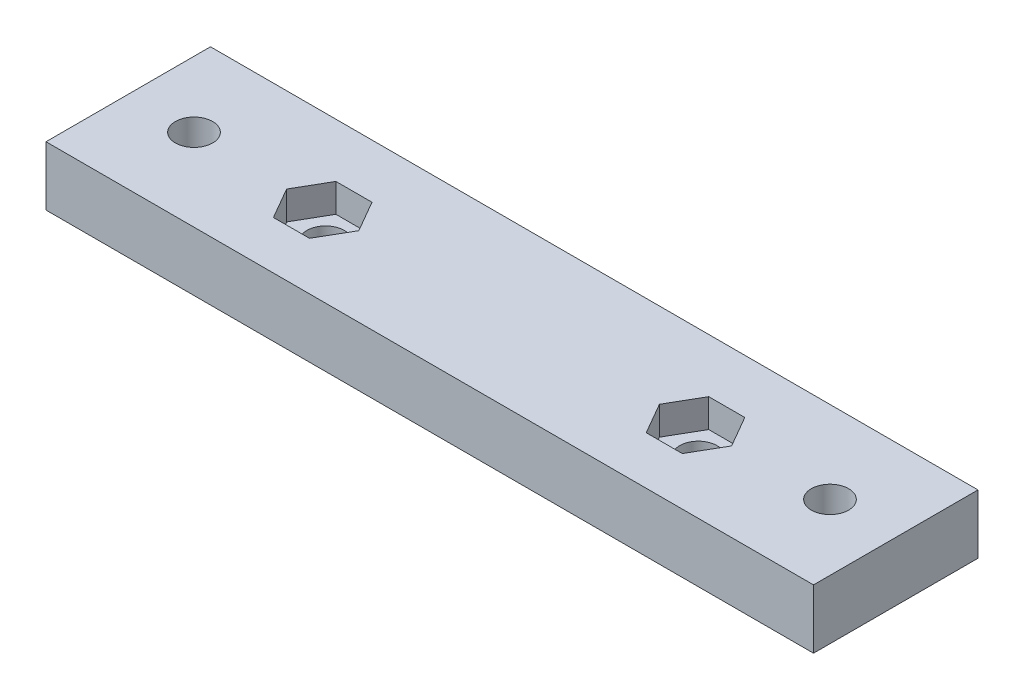
ISO-10303-21;
HEADER;
FILE_DESCRIPTION(('STEP AP214'),'2;1');
FILE_NAME('part.step','',(''),(''),'','','');
FILE_SCHEMA(('AUTOMOTIVE_DESIGN { 1 0 10303 214 1 1 1 1 }'));
ENDSEC;
DATA;
#1=APPLICATION_CONTEXT('core data for automotive mechanical design processes');
#2=APPLICATION_PROTOCOL_DEFINITION('international standard','automotive_design',2000,#1);
#3=PRODUCT_CONTEXT('',#1,'mechanical');
#4=PRODUCT('Part','Part','',(#3));
#5=PRODUCT_RELATED_PRODUCT_CATEGORY('part','',(#4));
#6=PRODUCT_DEFINITION_FORMATION('','',#4);
#7=PRODUCT_DEFINITION_CONTEXT('part definition',#1,'design');
#8=PRODUCT_DEFINITION('design','',#6,#7);
#9=PRODUCT_DEFINITION_SHAPE('','',#8);
#10=(LENGTH_UNIT() NAMED_UNIT(*) SI_UNIT(.MILLI.,.METRE.));
#11=(NAMED_UNIT(*) PLANE_ANGLE_UNIT() SI_UNIT($,.RADIAN.));
#12=(NAMED_UNIT(*) SI_UNIT($,.STERADIAN.) SOLID_ANGLE_UNIT());
#13=UNCERTAINTY_MEASURE_WITH_UNIT(LENGTH_MEASURE(1.E-05),#10,'distance_accuracy_value','');
#14=(GEOMETRIC_REPRESENTATION_CONTEXT(3) GLOBAL_UNCERTAINTY_ASSIGNED_CONTEXT((#13)) GLOBAL_UNIT_ASSIGNED_CONTEXT((#10,
#11,#12)) REPRESENTATION_CONTEXT('',''));
#15=CARTESIAN_POINT('',(0.,0.,0.));
#16=DIRECTION('',(0.,0.,1.));
#17=DIRECTION('',(1.,0.,0.));
#18=AXIS2_PLACEMENT_3D('',#15,#16,#17);
#19=CARTESIAN_POINT('',(0.,5.4,0.));
#20=DIRECTION('',(0.,-1.,0.));
#21=DIRECTION('',(0.,0.,-1.));
#22=AXIS2_PLACEMENT_3D('',#19,#20,#21);
#23=PLANE('',#22);
#24=CARTESIAN_POINT('',(-29.,5.4,0.));
#25=DIRECTION('',(0.,1.,0.));
#26=DIRECTION('',(0.,0.,1.));
#27=AXIS2_PLACEMENT_3D('',#24,#25,#26);
#28=CIRCLE('',#27,1.7);
#29=CARTESIAN_POINT('',(-29.,5.4,1.7));
#30=VERTEX_POINT('',#29);
#31=EDGE_CURVE('E286',#30,#30,#28,.T.);
#32=ORIENTED_EDGE('',*,*,#31,.F.);
#33=EDGE_LOOP('',(#32));
#34=FACE_BOUND('',#33,.T.);
#35=CARTESIAN_POINT('',(29.,5.4,0.));
#36=DIRECTION('',(0.,1.,0.));
#37=DIRECTION('',(0.,0.,-1.));
#38=AXIS2_PLACEMENT_3D('',#35,#36,#37);
#39=CIRCLE('',#38,1.7);
#40=CARTESIAN_POINT('',(29.,5.4,1.69999999999999));
#41=VERTEX_POINT('',#40);
#42=EDGE_CURVE('E297',#41,#41,#39,.T.);
#43=ORIENTED_EDGE('',*,*,#42,.F.);
#44=EDGE_LOOP('',(#43));
#45=FACE_BOUND('',#44,.T.);
#46=DIRECTION('',(-1.,0.,0.));
#47=VECTOR('',#46,1.);
#48=CARTESIAN_POINT('',(-15.3545517328094,5.4,-2.58658374021367));
#49=LINE('',#48,#47);
#50=CARTESIAN_POINT('',(-15.3545517328094,5.4,-2.58658374021367));
#51=VERTEX_POINT('',#50);
#52=CARTESIAN_POINT('',(-18.6454482671903,5.4,-2.58658374021367));
#53=VERTEX_POINT('',#52);
#54=EDGE_CURVE('E193',#51,#53,#49,.T.);
#55=ORIENTED_EDGE('',*,*,#54,.F.);
#56=DIRECTION('',(-0.500000000000001,0.,-0.866025403784438));
#57=VECTOR('',#56,1.);
#58=CARTESIAN_POINT('',(-13.709103465619,5.4,0.263416259786324));
#59=LINE('',#58,#57);
#60=CARTESIAN_POINT('',(-13.709103465619,5.4,0.263416259786324));
#61=VERTEX_POINT('',#60);
#62=EDGE_CURVE('E57',#61,#51,#59,.T.);
#63=ORIENTED_EDGE('',*,*,#62,.F.);
#64=DIRECTION('',(0.5,0.,-0.866025403784439));
#65=VECTOR('',#64,1.);
#66=CARTESIAN_POINT('',(-15.3545517328094,5.4,3.11341625978633));
#67=LINE('',#66,#65);
#68=CARTESIAN_POINT('',(-15.3545517328094,5.4,3.11341625978633));
#69=VERTEX_POINT('',#68);
#70=EDGE_CURVE('E177',#69,#61,#67,.T.);
#71=ORIENTED_EDGE('',*,*,#70,.F.);
#72=DIRECTION('',(1.,0.,0.));
#73=VECTOR('',#72,1.);
#74=CARTESIAN_POINT('',(-18.6454482671903,5.4,3.11341625978633));
#75=LINE('',#74,#73);
#76=CARTESIAN_POINT('',(-18.6454482671903,5.4,3.11341625978633));
#77=VERTEX_POINT('',#76);
#78=EDGE_CURVE('E180',#77,#69,#75,.T.);
#79=ORIENTED_EDGE('',*,*,#78,.F.);
#80=DIRECTION('',(0.5,0.,0.866025403784439));
#81=VECTOR('',#80,1.);
#82=CARTESIAN_POINT('',(-20.2908965343807,5.4,0.263416259786325));
#83=LINE('',#82,#81);
#84=CARTESIAN_POINT('',(-20.2908965343807,5.4,0.263416259786325));
#85=VERTEX_POINT('',#84);
#86=EDGE_CURVE('E200',#85,#77,#83,.T.);
#87=ORIENTED_EDGE('',*,*,#86,.F.);
#88=DIRECTION('',(-0.5,0.,0.866025403784439));
#89=VECTOR('',#88,1.);
#90=CARTESIAN_POINT('',(-18.6454482671903,5.4,-2.58658374021367));
#91=LINE('',#90,#89);
#92=EDGE_CURVE('E198',#53,#85,#91,.T.);
#93=ORIENTED_EDGE('',*,*,#92,.F.);
#94=EDGE_LOOP('',(#55,#63,#71,#79,#87,#93));
#95=FACE_BOUND('',#94,.T.);
#96=DIRECTION('',(0.,0.,-1.));
#97=VECTOR('',#96,1.);
#98=CARTESIAN_POINT('',(35.,5.4,7.5));
#99=LINE('',#98,#97);
#100=CARTESIAN_POINT('',(35.,5.4,7.5));
#101=VERTEX_POINT('',#100);
#102=CARTESIAN_POINT('',(35.,5.4,-7.5));
#103=VERTEX_POINT('',#102);
#104=EDGE_CURVE('E254',#101,#103,#99,.T.);
#105=ORIENTED_EDGE('',*,*,#104,.T.);
#106=DIRECTION('',(-1.,0.,0.));
#107=VECTOR('',#106,1.);
#108=CARTESIAN_POINT('',(-35.,5.4,-7.5));
#109=LINE('',#108,#107);
#110=CARTESIAN_POINT('',(-35.,5.4,-7.5));
#111=VERTEX_POINT('',#110);
#112=EDGE_CURVE('E256',#103,#111,#109,.T.);
#113=ORIENTED_EDGE('',*,*,#112,.T.);
#114=DIRECTION('',(0.,0.,1.));
#115=VECTOR('',#114,1.);
#116=CARTESIAN_POINT('',(-35.,5.4,7.5));
#117=LINE('',#116,#115);
#118=CARTESIAN_POINT('',(-35.,5.4,7.5));
#119=VERTEX_POINT('',#118);
#120=EDGE_CURVE('E261',#111,#119,#117,.T.);
#121=ORIENTED_EDGE('',*,*,#120,.T.);
#122=DIRECTION('',(1.,0.,0.));
#123=VECTOR('',#122,1.);
#124=CARTESIAN_POINT('',(-35.,5.4,7.5));
#125=LINE('',#124,#123);
#126=EDGE_CURVE('E263',#119,#101,#125,.T.);
#127=ORIENTED_EDGE('',*,*,#126,.T.);
#128=EDGE_LOOP('',(#105,#113,#121,#127));
#129=FACE_BOUND('',#128,.T.);
#130=DIRECTION('',(-0.5,0.,-0.866025403784439));
#131=VECTOR('',#130,1.);
#132=CARTESIAN_POINT('',(15.3545517328094,5.4,3.11341625978633));
#133=LINE('',#132,#131);
#134=CARTESIAN_POINT('',(15.3545517328094,5.4,3.11341625978633));
#135=VERTEX_POINT('',#134);
#136=CARTESIAN_POINT('',(13.709103465619,5.4,0.263416259786324));
#137=VERTEX_POINT('',#136);
#138=EDGE_CURVE('E65',#135,#137,#133,.T.);
#139=ORIENTED_EDGE('',*,*,#138,.T.);
#140=DIRECTION('',(0.500000000000001,0.,-0.866025403784438));
#141=VECTOR('',#140,1.);
#142=CARTESIAN_POINT('',(13.709103465619,5.4,0.263416259786324));
#143=LINE('',#142,#141);
#144=CARTESIAN_POINT('',(15.3545517328094,5.4,-2.58658374021367));
#145=VERTEX_POINT('',#144);
#146=EDGE_CURVE('E238',#137,#145,#143,.T.);
#147=ORIENTED_EDGE('',*,*,#146,.T.);
#148=DIRECTION('',(1.,0.,0.));
#149=VECTOR('',#148,1.);
#150=CARTESIAN_POINT('',(15.3545517328094,5.4,-2.58658374021367));
#151=LINE('',#150,#149);
#152=CARTESIAN_POINT('',(18.6454482671903,5.4,-2.58658374021367));
#153=VERTEX_POINT('',#152);
#154=EDGE_CURVE('E240',#145,#153,#151,.T.);
#155=ORIENTED_EDGE('',*,*,#154,.T.);
#156=DIRECTION('',(0.5,0.,0.866025403784439));
#157=VECTOR('',#156,1.);
#158=CARTESIAN_POINT('',(18.6454482671903,5.4,-2.58658374021367));
#159=LINE('',#158,#157);
#160=CARTESIAN_POINT('',(20.2908965343807,5.4,0.263416259786325));
#161=VERTEX_POINT('',#160);
#162=EDGE_CURVE('E233',#153,#161,#159,.T.);
#163=ORIENTED_EDGE('',*,*,#162,.T.);
#164=DIRECTION('',(-0.5,0.,0.866025403784439));
#165=VECTOR('',#164,1.);
#166=CARTESIAN_POINT('',(20.2908965343807,5.4,0.263416259786325));
#167=LINE('',#166,#165);
#168=CARTESIAN_POINT('',(18.6454482671903,5.4,3.11341625978633));
#169=VERTEX_POINT('',#168);
#170=EDGE_CURVE('E226',#161,#169,#167,.T.);
#171=ORIENTED_EDGE('',*,*,#170,.T.);
#172=DIRECTION('',(-1.,0.,0.));
#173=VECTOR('',#172,1.);
#174=CARTESIAN_POINT('',(18.6454482671903,5.4,3.11341625978633));
#175=LINE('',#174,#173);
#176=EDGE_CURVE('E229',#169,#135,#175,.T.);
#177=ORIENTED_EDGE('',*,*,#176,.T.);
#178=EDGE_LOOP('',(#139,#147,#155,#163,#171,#177));
#179=FACE_BOUND('',#178,.T.);
#180=ADVANCED_FACE('F39',(#34,#45,#95,#129,#179),#23,.F.);
#181=CARTESIAN_POINT('',(35.,5.4,7.5));
#182=DIRECTION('',(-1.,0.,0.));
#183=DIRECTION('',(0.,0.,1.));
#184=AXIS2_PLACEMENT_3D('',#181,#182,#183);
#185=PLANE('',#184);
#186=DIRECTION('',(0.,0.,-1.));
#187=VECTOR('',#186,1.);
#188=CARTESIAN_POINT('',(35.,0.,7.5));
#189=LINE('',#188,#187);
#190=CARTESIAN_POINT('',(35.,0.,7.5));
#191=VERTEX_POINT('',#190);
#192=CARTESIAN_POINT('',(35.,0.,-7.5));
#193=VERTEX_POINT('',#192);
#194=EDGE_CURVE('E206',#191,#193,#189,.T.);
#195=ORIENTED_EDGE('',*,*,#194,.T.);
#196=DIRECTION('',(0.,-1.,0.));
#197=VECTOR('',#196,1.);
#198=CARTESIAN_POINT('',(35.,5.4,-7.5));
#199=LINE('',#198,#197);
#200=EDGE_CURVE('E11',#103,#193,#199,.T.);
#201=ORIENTED_EDGE('',*,*,#200,.F.);
#202=ORIENTED_EDGE('',*,*,#104,.F.);
#203=DIRECTION('',(0.,-1.,0.));
#204=VECTOR('',#203,1.);
#205=CARTESIAN_POINT('',(35.,5.4,7.5));
#206=LINE('',#205,#204);
#207=EDGE_CURVE('E264',#101,#191,#206,.T.);
#208=ORIENTED_EDGE('',*,*,#207,.T.);
#209=EDGE_LOOP('',(#195,#201,#202,#208));
#210=FACE_BOUND('',#209,.T.);
#211=ADVANCED_FACE('F41',(#210),#185,.F.);
#212=CARTESIAN_POINT('',(-35.,5.4,-7.5));
#213=DIRECTION('',(0.,0.,1.));
#214=DIRECTION('',(1.,0.,0.));
#215=AXIS2_PLACEMENT_3D('',#212,#213,#214);
#216=PLANE('',#215);
#217=DIRECTION('',(-1.,0.,0.));
#218=VECTOR('',#217,1.);
#219=CARTESIAN_POINT('',(-35.,0.,-7.5));
#220=LINE('',#219,#218);
#221=CARTESIAN_POINT('',(-35.,0.,-7.5));
#222=VERTEX_POINT('',#221);
#223=EDGE_CURVE('E268',#193,#222,#220,.T.);
#224=ORIENTED_EDGE('',*,*,#223,.T.);
#225=DIRECTION('',(0.,-1.,0.));
#226=VECTOR('',#225,1.);
#227=CARTESIAN_POINT('',(-35.,5.4,-7.5));
#228=LINE('',#227,#226);
#229=EDGE_CURVE('E48',#111,#222,#228,.T.);
#230=ORIENTED_EDGE('',*,*,#229,.F.);
#231=ORIENTED_EDGE('',*,*,#112,.F.);
#232=ORIENTED_EDGE('',*,*,#200,.T.);
#233=EDGE_LOOP('',(#224,#230,#231,#232));
#234=FACE_BOUND('',#233,.T.);
#235=ADVANCED_FACE('F335',(#234),#216,.F.);
#236=CARTESIAN_POINT('',(-35.,5.4,7.5));
#237=DIRECTION('',(1.,0.,0.));
#238=DIRECTION('',(0.,0.,-1.));
#239=AXIS2_PLACEMENT_3D('',#236,#237,#238);
#240=PLANE('',#239);
#241=DIRECTION('',(0.,0.,1.));
#242=VECTOR('',#241,1.);
#243=CARTESIAN_POINT('',(-35.,0.,7.5));
#244=LINE('',#243,#242);
#245=CARTESIAN_POINT('',(-35.,0.,7.5));
#246=VERTEX_POINT('',#245);
#247=EDGE_CURVE('E269',#222,#246,#244,.T.);
#248=ORIENTED_EDGE('',*,*,#247,.T.);
#249=DIRECTION('',(0.,-1.,0.));
#250=VECTOR('',#249,1.);
#251=CARTESIAN_POINT('',(-35.,5.4,7.5));
#252=LINE('',#251,#250);
#253=EDGE_CURVE('E274',#119,#246,#252,.T.);
#254=ORIENTED_EDGE('',*,*,#253,.F.);
#255=ORIENTED_EDGE('',*,*,#120,.F.);
#256=ORIENTED_EDGE('',*,*,#229,.T.);
#257=EDGE_LOOP('',(#248,#254,#255,#256));
#258=FACE_BOUND('',#257,.T.);
#259=ADVANCED_FACE('F345',(#258),#240,.F.);
#260=CARTESIAN_POINT('',(-35.,5.4,7.5));
#261=DIRECTION('',(0.,0.,-1.));
#262=DIRECTION('',(-1.,0.,0.));
#263=AXIS2_PLACEMENT_3D('',#260,#261,#262);
#264=PLANE('',#263);
#265=DIRECTION('',(1.,0.,0.));
#266=VECTOR('',#265,1.);
#267=CARTESIAN_POINT('',(-35.,0.,7.5));
#268=LINE('',#267,#266);
#269=EDGE_CURVE('E259',#246,#191,#268,.T.);
#270=ORIENTED_EDGE('',*,*,#269,.T.);
#271=ORIENTED_EDGE('',*,*,#207,.F.);
#272=ORIENTED_EDGE('',*,*,#126,.F.);
#273=ORIENTED_EDGE('',*,*,#253,.T.);
#274=EDGE_LOOP('',(#270,#271,#272,#273));
#275=FACE_BOUND('',#274,.T.);
#276=ADVANCED_FACE('F342',(#275),#264,.F.);
#277=CARTESIAN_POINT('',(0.,0.,0.));
#278=DIRECTION('',(0.,-1.,0.));
#279=DIRECTION('',(0.,0.,-1.));
#280=AXIS2_PLACEMENT_3D('',#277,#278,#279);
#281=PLANE('',#280);
#282=CARTESIAN_POINT('',(-29.,0.,0.));
#283=DIRECTION('',(0.,1.,0.));
#284=DIRECTION('',(0.,0.,1.));
#285=AXIS2_PLACEMENT_3D('',#282,#283,#284);
#286=CIRCLE('',#285,1.7);
#287=CARTESIAN_POINT('',(-29.,0.,1.7));
#288=VERTEX_POINT('',#287);
#289=EDGE_CURVE('E283',#288,#288,#286,.T.);
#290=ORIENTED_EDGE('',*,*,#289,.T.);
#291=EDGE_LOOP('',(#290));
#292=FACE_BOUND('',#291,.T.);
#293=CARTESIAN_POINT('',(17.,0.,0.));
#294=DIRECTION('',(0.,1.,0.));
#295=DIRECTION('',(0.,0.,-1.));
#296=AXIS2_PLACEMENT_3D('',#293,#294,#295);
#297=CIRCLE('',#296,1.7);
#298=CARTESIAN_POINT('',(17.,0.,1.69999999999999));
#299=VERTEX_POINT('',#298);
#300=EDGE_CURVE('E292',#299,#299,#297,.T.);
#301=ORIENTED_EDGE('',*,*,#300,.T.);
#302=EDGE_LOOP('',(#301));
#303=FACE_BOUND('',#302,.T.);
#304=CARTESIAN_POINT('',(-17.,0.,0.));
#305=DIRECTION('',(0.,1.,0.));
#306=DIRECTION('',(0.,0.,1.));
#307=AXIS2_PLACEMENT_3D('',#304,#305,#306);
#308=CIRCLE('',#307,1.7);
#309=CARTESIAN_POINT('',(-17.,0.,1.7));
#310=VERTEX_POINT('',#309);
#311=EDGE_CURVE('E298',#310,#310,#308,.T.);
#312=ORIENTED_EDGE('',*,*,#311,.T.);
#313=EDGE_LOOP('',(#312));
#314=FACE_BOUND('',#313,.T.);
#315=CARTESIAN_POINT('',(29.,0.,0.));
#316=DIRECTION('',(0.,1.,0.));
#317=DIRECTION('',(0.,0.,-1.));
#318=AXIS2_PLACEMENT_3D('',#315,#316,#317);
#319=CIRCLE('',#318,1.7);
#320=CARTESIAN_POINT('',(29.,0.,1.69999999999999));
#321=VERTEX_POINT('',#320);
#322=EDGE_CURVE('E181',#321,#321,#319,.T.);
#323=ORIENTED_EDGE('',*,*,#322,.T.);
#324=EDGE_LOOP('',(#323));
#325=FACE_BOUND('',#324,.T.);
#326=ORIENTED_EDGE('',*,*,#194,.F.);
#327=ORIENTED_EDGE('',*,*,#269,.F.);
#328=ORIENTED_EDGE('',*,*,#247,.F.);
#329=ORIENTED_EDGE('',*,*,#223,.F.);
#330=EDGE_LOOP('',(#326,#327,#328,#329));
#331=FACE_BOUND('',#330,.T.);
#332=ADVANCED_FACE('F305',(#292,#303,#314,#325,#331),#281,.T.);
#333=CARTESIAN_POINT('',(15.3545517328094,2.8,3.11341625978633));
#334=DIRECTION('',(0.866025403784439,0.,-0.5));
#335=DIRECTION('',(-0.5,0.,-0.866025403784439));
#336=AXIS2_PLACEMENT_3D('',#333,#334,#335);
#337=PLANE('',#336);
#338=ORIENTED_EDGE('',*,*,#138,.F.);
#339=DIRECTION('',(0.,1.,0.));
#340=VECTOR('',#339,1.);
#341=CARTESIAN_POINT('',(15.3545517328094,2.8,3.11341625978633));
#342=LINE('',#341,#340);
#343=CARTESIAN_POINT('',(15.3545517328094,2.8,3.11341625978633));
#344=VERTEX_POINT('',#343);
#345=EDGE_CURVE('E221',#344,#135,#342,.T.);
#346=ORIENTED_EDGE('',*,*,#345,.F.);
#347=DIRECTION('',(-0.5,0.,-0.866025403784439));
#348=VECTOR('',#347,1.);
#349=CARTESIAN_POINT('',(15.3545517328094,2.8,3.11341625978633));
#350=LINE('',#349,#348);
#351=CARTESIAN_POINT('',(13.709103465619,2.8,0.263416259786324));
#352=VERTEX_POINT('',#351);
#353=EDGE_CURVE('E231',#344,#352,#350,.T.);
#354=ORIENTED_EDGE('',*,*,#353,.T.);
#355=DIRECTION('',(0.,1.,0.));
#356=VECTOR('',#355,1.);
#357=CARTESIAN_POINT('',(13.709103465619,2.8,0.263416259786324));
#358=LINE('',#357,#356);
#359=EDGE_CURVE('E212',#352,#137,#358,.T.);
#360=ORIENTED_EDGE('',*,*,#359,.T.);
#361=EDGE_LOOP('',(#338,#346,#354,#360));
#362=FACE_BOUND('',#361,.T.);
#363=ADVANCED_FACE('F341',(#362),#337,.T.);
#364=CARTESIAN_POINT('',(13.709103465619,2.8,0.263416259786324));
#365=DIRECTION('',(0.866025403784438,0.,0.500000000000001));
#366=DIRECTION('',(0.500000000000001,0.,-0.866025403784438));
#367=AXIS2_PLACEMENT_3D('',#364,#365,#366);
#368=PLANE('',#367);
#369=ORIENTED_EDGE('',*,*,#146,.F.);
#370=ORIENTED_EDGE('',*,*,#359,.F.);
#371=DIRECTION('',(0.500000000000001,0.,-0.866025403784438));
#372=VECTOR('',#371,1.);
#373=CARTESIAN_POINT('',(13.709103465619,2.8,0.263416259786324));
#374=LINE('',#373,#372);
#375=CARTESIAN_POINT('',(15.3545517328094,2.8,-2.58658374021367));
#376=VERTEX_POINT('',#375);
#377=EDGE_CURVE('E253',#352,#376,#374,.T.);
#378=ORIENTED_EDGE('',*,*,#377,.T.);
#379=DIRECTION('',(0.,1.,0.));
#380=VECTOR('',#379,1.);
#381=CARTESIAN_POINT('',(15.3545517328094,2.8,-2.58658374021367));
#382=LINE('',#381,#380);
#383=EDGE_CURVE('E216',#376,#145,#382,.T.);
#384=ORIENTED_EDGE('',*,*,#383,.T.);
#385=EDGE_LOOP('',(#369,#370,#378,#384));
#386=FACE_BOUND('',#385,.T.);
#387=ADVANCED_FACE('F377',(#386),#368,.T.);
#388=CARTESIAN_POINT('',(15.3545517328094,2.8,-2.58658374021367));
#389=DIRECTION('',(0.,0.,1.));
#390=DIRECTION('',(1.,0.,0.));
#391=AXIS2_PLACEMENT_3D('',#388,#389,#390);
#392=PLANE('',#391);
#393=ORIENTED_EDGE('',*,*,#154,.F.);
#394=ORIENTED_EDGE('',*,*,#383,.F.);
#395=DIRECTION('',(1.,0.,0.));
#396=VECTOR('',#395,1.);
#397=CARTESIAN_POINT('',(15.3545517328094,2.8,-2.58658374021367));
#398=LINE('',#397,#396);
#399=CARTESIAN_POINT('',(18.6454482671903,2.8,-2.58658374021367));
#400=VERTEX_POINT('',#399);
#401=EDGE_CURVE('E248',#376,#400,#398,.T.);
#402=ORIENTED_EDGE('',*,*,#401,.T.);
#403=DIRECTION('',(0.,1.,0.));
#404=VECTOR('',#403,1.);
#405=CARTESIAN_POINT('',(18.6454482671903,2.8,-2.58658374021367));
#406=LINE('',#405,#404);
#407=EDGE_CURVE('E217',#400,#153,#406,.T.);
#408=ORIENTED_EDGE('',*,*,#407,.T.);
#409=EDGE_LOOP('',(#393,#394,#402,#408));
#410=FACE_BOUND('',#409,.T.);
#411=ADVANCED_FACE('F385',(#410),#392,.T.);
#412=CARTESIAN_POINT('',(18.6454482671903,2.8,-2.58658374021367));
#413=DIRECTION('',(-0.866025403784439,0.,0.5));
#414=DIRECTION('',(0.5,0.,0.866025403784439));
#415=AXIS2_PLACEMENT_3D('',#412,#413,#414);
#416=PLANE('',#415);
#417=ORIENTED_EDGE('',*,*,#162,.F.);
#418=ORIENTED_EDGE('',*,*,#407,.F.);
#419=DIRECTION('',(0.5,0.,0.866025403784439));
#420=VECTOR('',#419,1.);
#421=CARTESIAN_POINT('',(18.6454482671903,2.8,-2.58658374021367));
#422=LINE('',#421,#420);
#423=CARTESIAN_POINT('',(20.2908965343807,2.8,0.263416259786325));
#424=VERTEX_POINT('',#423);
#425=EDGE_CURVE('E247',#400,#424,#422,.T.);
#426=ORIENTED_EDGE('',*,*,#425,.T.);
#427=DIRECTION('',(0.,1.,0.));
#428=VECTOR('',#427,1.);
#429=CARTESIAN_POINT('',(20.2908965343807,2.8,0.263416259786325));
#430=LINE('',#429,#428);
#431=EDGE_CURVE('E219',#424,#161,#430,.T.);
#432=ORIENTED_EDGE('',*,*,#431,.T.);
#433=EDGE_LOOP('',(#417,#418,#426,#432));
#434=FACE_BOUND('',#433,.T.);
#435=ADVANCED_FACE('F387',(#434),#416,.T.);
#436=CARTESIAN_POINT('',(20.2908965343807,2.8,0.263416259786325));
#437=DIRECTION('',(-0.866025403784439,0.,-0.5));
#438=DIRECTION('',(-0.5,0.,0.866025403784439));
#439=AXIS2_PLACEMENT_3D('',#436,#437,#438);
#440=PLANE('',#439);
#441=ORIENTED_EDGE('',*,*,#170,.F.);
#442=ORIENTED_EDGE('',*,*,#431,.F.);
#443=DIRECTION('',(-0.5,0.,0.866025403784439));
#444=VECTOR('',#443,1.);
#445=CARTESIAN_POINT('',(20.2908965343807,2.8,0.263416259786325));
#446=LINE('',#445,#444);
#447=CARTESIAN_POINT('',(18.6454482671903,2.8,3.11341625978633));
#448=VERTEX_POINT('',#447);
#449=EDGE_CURVE('E241',#424,#448,#446,.T.);
#450=ORIENTED_EDGE('',*,*,#449,.T.);
#451=DIRECTION('',(0.,1.,0.));
#452=VECTOR('',#451,1.);
#453=CARTESIAN_POINT('',(18.6454482671903,2.8,3.11341625978633));
#454=LINE('',#453,#452);
#455=EDGE_CURVE('E225',#448,#169,#454,.T.);
#456=ORIENTED_EDGE('',*,*,#455,.T.);
#457=EDGE_LOOP('',(#441,#442,#450,#456));
#458=FACE_BOUND('',#457,.T.);
#459=ADVANCED_FACE('F386',(#458),#440,.T.);
#460=CARTESIAN_POINT('',(18.6454482671903,2.8,3.11341625978633));
#461=DIRECTION('',(0.,0.,-1.));
#462=DIRECTION('',(-1.,0.,0.));
#463=AXIS2_PLACEMENT_3D('',#460,#461,#462);
#464=PLANE('',#463);
#465=ORIENTED_EDGE('',*,*,#176,.F.);
#466=ORIENTED_EDGE('',*,*,#455,.F.);
#467=DIRECTION('',(-1.,0.,0.));
#468=VECTOR('',#467,1.);
#469=CARTESIAN_POINT('',(18.6454482671903,2.8,3.11341625978633));
#470=LINE('',#469,#468);
#471=EDGE_CURVE('E228',#448,#344,#470,.T.);
#472=ORIENTED_EDGE('',*,*,#471,.T.);
#473=ORIENTED_EDGE('',*,*,#345,.T.);
#474=EDGE_LOOP('',(#465,#466,#472,#473));
#475=FACE_BOUND('',#474,.T.);
#476=ADVANCED_FACE('F369',(#475),#464,.T.);
#477=CARTESIAN_POINT('',(0.,2.8,0.));
#478=DIRECTION('',(0.,-1.,0.));
#479=DIRECTION('',(0.,0.,-1.));
#480=AXIS2_PLACEMENT_3D('',#477,#478,#479);
#481=PLANE('',#480);
#482=CARTESIAN_POINT('',(17.,2.8,0.));
#483=DIRECTION('',(0.,-1.,0.));
#484=DIRECTION('',(0.,0.,-1.));
#485=AXIS2_PLACEMENT_3D('',#482,#483,#484);
#486=CIRCLE('',#485,1.7);
#487=CARTESIAN_POINT('',(17.,2.8,1.69999999999999));
#488=VERTEX_POINT('',#487);
#489=EDGE_CURVE('E43',#488,#488,#486,.T.);
#490=ORIENTED_EDGE('',*,*,#489,.T.);
#491=EDGE_LOOP('',(#490));
#492=FACE_BOUND('',#491,.T.);
#493=ORIENTED_EDGE('',*,*,#353,.F.);
#494=ORIENTED_EDGE('',*,*,#471,.F.);
#495=ORIENTED_EDGE('',*,*,#449,.F.);
#496=ORIENTED_EDGE('',*,*,#425,.F.);
#497=ORIENTED_EDGE('',*,*,#401,.F.);
#498=ORIENTED_EDGE('',*,*,#377,.F.);
#499=EDGE_LOOP('',(#493,#494,#495,#496,#497,#498));
#500=FACE_BOUND('',#499,.T.);
#501=ADVANCED_FACE('F337',(#492,#500),#481,.F.);
#502=CARTESIAN_POINT('',(-13.709103465619,2.8,0.263416259786324));
#503=DIRECTION('',(0.866025403784438,0.,-0.500000000000001));
#504=DIRECTION('',(-0.500000000000001,0.,-0.866025403784438));
#505=AXIS2_PLACEMENT_3D('',#502,#503,#504);
#506=PLANE('',#505);
#507=ORIENTED_EDGE('',*,*,#62,.T.);
#508=DIRECTION('',(0.,1.,0.));
#509=VECTOR('',#508,1.);
#510=CARTESIAN_POINT('',(-15.3545517328094,2.8,-2.58658374021367));
#511=LINE('',#510,#509);
#512=CARTESIAN_POINT('',(-15.3545517328094,2.8,-2.58658374021367));
#513=VERTEX_POINT('',#512);
#514=EDGE_CURVE('E152',#513,#51,#511,.T.);
#515=ORIENTED_EDGE('',*,*,#514,.F.);
#516=DIRECTION('',(-0.500000000000001,0.,-0.866025403784438));
#517=VECTOR('',#516,1.);
#518=CARTESIAN_POINT('',(-13.709103465619,2.8,0.263416259786324));
#519=LINE('',#518,#517);
#520=CARTESIAN_POINT('',(-13.709103465619,2.8,0.263416259786324));
#521=VERTEX_POINT('',#520);
#522=EDGE_CURVE('E158',#521,#513,#519,.T.);
#523=ORIENTED_EDGE('',*,*,#522,.F.);
#524=DIRECTION('',(0.,1.,0.));
#525=VECTOR('',#524,1.);
#526=CARTESIAN_POINT('',(-13.709103465619,2.8,0.263416259786324));
#527=LINE('',#526,#525);
#528=EDGE_CURVE('E204',#521,#61,#527,.T.);
#529=ORIENTED_EDGE('',*,*,#528,.T.);
#530=EDGE_LOOP('',(#507,#515,#523,#529));
#531=FACE_BOUND('',#530,.T.);
#532=ADVANCED_FACE('F156',(#531),#506,.F.);
#533=CARTESIAN_POINT('',(-15.3545517328094,2.8,3.11341625978633));
#534=DIRECTION('',(0.866025403784439,0.,0.5));
#535=DIRECTION('',(0.5,0.,-0.866025403784439));
#536=AXIS2_PLACEMENT_3D('',#533,#534,#535);
#537=PLANE('',#536);
#538=ORIENTED_EDGE('',*,*,#70,.T.);
#539=ORIENTED_EDGE('',*,*,#528,.F.);
#540=DIRECTION('',(0.5,0.,-0.866025403784439));
#541=VECTOR('',#540,1.);
#542=CARTESIAN_POINT('',(-15.3545517328094,2.8,3.11341625978633));
#543=LINE('',#542,#541);
#544=CARTESIAN_POINT('',(-15.3545517328094,2.8,3.11341625978633));
#545=VERTEX_POINT('',#544);
#546=EDGE_CURVE('E163',#545,#521,#543,.T.);
#547=ORIENTED_EDGE('',*,*,#546,.F.);
#548=DIRECTION('',(0.,1.,0.));
#549=VECTOR('',#548,1.);
#550=CARTESIAN_POINT('',(-15.3545517328094,2.8,3.11341625978633));
#551=LINE('',#550,#549);
#552=EDGE_CURVE('E210',#545,#69,#551,.T.);
#553=ORIENTED_EDGE('',*,*,#552,.T.);
#554=EDGE_LOOP('',(#538,#539,#547,#553));
#555=FACE_BOUND('',#554,.T.);
#556=ADVANCED_FACE('F408',(#555),#537,.F.);
#557=CARTESIAN_POINT('',(-18.6454482671903,2.8,3.11341625978633));
#558=DIRECTION('',(0.,0.,1.));
#559=DIRECTION('',(1.,0.,0.));
#560=AXIS2_PLACEMENT_3D('',#557,#558,#559);
#561=PLANE('',#560);
#562=ORIENTED_EDGE('',*,*,#78,.T.);
#563=ORIENTED_EDGE('',*,*,#552,.F.);
#564=DIRECTION('',(1.,0.,0.));
#565=VECTOR('',#564,1.);
#566=CARTESIAN_POINT('',(-18.6454482671903,2.8,3.11341625978633));
#567=LINE('',#566,#565);
#568=CARTESIAN_POINT('',(-18.6454482671903,2.8,3.11341625978633));
#569=VERTEX_POINT('',#568);
#570=EDGE_CURVE('E186',#569,#545,#567,.T.);
#571=ORIENTED_EDGE('',*,*,#570,.F.);
#572=DIRECTION('',(0.,1.,0.));
#573=VECTOR('',#572,1.);
#574=CARTESIAN_POINT('',(-18.6454482671903,2.8,3.11341625978633));
#575=LINE('',#574,#573);
#576=EDGE_CURVE('E207',#569,#77,#575,.T.);
#577=ORIENTED_EDGE('',*,*,#576,.T.);
#578=EDGE_LOOP('',(#562,#563,#571,#577));
#579=FACE_BOUND('',#578,.T.);
#580=ADVANCED_FACE('F415',(#579),#561,.F.);
#581=CARTESIAN_POINT('',(-20.2908965343807,2.8,0.263416259786325));
#582=DIRECTION('',(-0.866025403784439,0.,0.5));
#583=DIRECTION('',(0.5,0.,0.866025403784439));
#584=AXIS2_PLACEMENT_3D('',#581,#582,#583);
#585=PLANE('',#584);
#586=ORIENTED_EDGE('',*,*,#86,.T.);
#587=ORIENTED_EDGE('',*,*,#576,.F.);
#588=DIRECTION('',(0.5,0.,0.866025403784439));
#589=VECTOR('',#588,1.);
#590=CARTESIAN_POINT('',(-20.2908965343807,2.8,0.263416259786325));
#591=LINE('',#590,#589);
#592=CARTESIAN_POINT('',(-20.2908965343807,2.8,0.263416259786325));
#593=VERTEX_POINT('',#592);
#594=EDGE_CURVE('E189',#593,#569,#591,.T.);
#595=ORIENTED_EDGE('',*,*,#594,.F.);
#596=DIRECTION('',(0.,1.,0.));
#597=VECTOR('',#596,1.);
#598=CARTESIAN_POINT('',(-20.2908965343807,2.8,0.263416259786325));
#599=LINE('',#598,#597);
#600=EDGE_CURVE('E211',#593,#85,#599,.T.);
#601=ORIENTED_EDGE('',*,*,#600,.T.);
#602=EDGE_LOOP('',(#586,#587,#595,#601));
#603=FACE_BOUND('',#602,.T.);
#604=ADVANCED_FACE('F411',(#603),#585,.F.);
#605=CARTESIAN_POINT('',(-18.6454482671903,2.8,-2.58658374021367));
#606=DIRECTION('',(-0.866025403784439,0.,-0.5));
#607=DIRECTION('',(-0.5,0.,0.866025403784439));
#608=AXIS2_PLACEMENT_3D('',#605,#606,#607);
#609=PLANE('',#608);
#610=ORIENTED_EDGE('',*,*,#92,.T.);
#611=ORIENTED_EDGE('',*,*,#600,.F.);
#612=DIRECTION('',(-0.5,0.,0.866025403784439));
#613=VECTOR('',#612,1.);
#614=CARTESIAN_POINT('',(-18.6454482671903,2.8,-2.58658374021367));
#615=LINE('',#614,#613);
#616=CARTESIAN_POINT('',(-18.6454482671903,2.8,-2.58658374021367));
#617=VERTEX_POINT('',#616);
#618=EDGE_CURVE('E174',#617,#593,#615,.T.);
#619=ORIENTED_EDGE('',*,*,#618,.F.);
#620=DIRECTION('',(0.,1.,0.));
#621=VECTOR('',#620,1.);
#622=CARTESIAN_POINT('',(-18.6454482671903,2.8,-2.58658374021367));
#623=LINE('',#622,#621);
#624=EDGE_CURVE('E162',#617,#53,#623,.T.);
#625=ORIENTED_EDGE('',*,*,#624,.T.);
#626=EDGE_LOOP('',(#610,#611,#619,#625));
#627=FACE_BOUND('',#626,.T.);
#628=ADVANCED_FACE('F407',(#627),#609,.F.);
#629=CARTESIAN_POINT('',(-15.3545517328094,2.8,-2.58658374021367));
#630=DIRECTION('',(0.,0.,-1.));
#631=DIRECTION('',(-1.,0.,0.));
#632=AXIS2_PLACEMENT_3D('',#629,#630,#631);
#633=PLANE('',#632);
#634=ORIENTED_EDGE('',*,*,#54,.T.);
#635=ORIENTED_EDGE('',*,*,#624,.F.);
#636=DIRECTION('',(-1.,0.,0.));
#637=VECTOR('',#636,1.);
#638=CARTESIAN_POINT('',(-15.3545517328094,2.8,-2.58658374021367));
#639=LINE('',#638,#637);
#640=EDGE_CURVE('E170',#513,#617,#639,.T.);
#641=ORIENTED_EDGE('',*,*,#640,.F.);
#642=ORIENTED_EDGE('',*,*,#514,.T.);
#643=EDGE_LOOP('',(#634,#635,#641,#642));
#644=FACE_BOUND('',#643,.T.);
#645=ADVANCED_FACE('F169',(#644),#633,.F.);
#646=CARTESIAN_POINT('',(0.,2.8,0.));
#647=DIRECTION('',(0.,1.,0.));
#648=DIRECTION('',(0.,0.,1.));
#649=AXIS2_PLACEMENT_3D('',#646,#647,#648);
#650=PLANE('',#649);
#651=CARTESIAN_POINT('',(-17.,2.8,0.));
#652=DIRECTION('',(0.,1.,0.));
#653=DIRECTION('',(0.,0.,1.));
#654=AXIS2_PLACEMENT_3D('',#651,#652,#653);
#655=CIRCLE('',#654,1.7);
#656=CARTESIAN_POINT('',(-17.,2.8,1.7));
#657=VERTEX_POINT('',#656);
#658=EDGE_CURVE('E276',#657,#657,#655,.T.);
#659=ORIENTED_EDGE('',*,*,#658,.F.);
#660=EDGE_LOOP('',(#659));
#661=FACE_BOUND('',#660,.T.);
#662=ORIENTED_EDGE('',*,*,#522,.T.);
#663=ORIENTED_EDGE('',*,*,#640,.T.);
#664=ORIENTED_EDGE('',*,*,#618,.T.);
#665=ORIENTED_EDGE('',*,*,#594,.T.);
#666=ORIENTED_EDGE('',*,*,#570,.T.);
#667=ORIENTED_EDGE('',*,*,#546,.T.);
#668=EDGE_LOOP('',(#662,#663,#664,#665,#666,#667));
#669=FACE_BOUND('',#668,.T.);
#670=ADVANCED_FACE('F175',(#661,#669),#650,.T.);
#671=CARTESIAN_POINT('',(-17.,0.,0.));
#672=DIRECTION('',(0.,1.,0.));
#673=DIRECTION('',(0.,0.,1.));
#674=AXIS2_PLACEMENT_3D('',#671,#672,#673);
#675=CYLINDRICAL_SURFACE('',#674,1.7);
#676=CARTESIAN_POINT('',(-17.,2.8,1.7));
#677=CARTESIAN_POINT('',(-17.,2.77083333333333,1.7));
#678=CARTESIAN_POINT('',(-17.,2.74166666666667,1.7));
#679=CARTESIAN_POINT('',(-17.,2.68333333333333,1.7));
#680=CARTESIAN_POINT('',(-17.,2.65416666666667,1.7));
#681=CARTESIAN_POINT('',(-17.,2.59583333333333,1.7));
#682=CARTESIAN_POINT('',(-17.,2.56666666666667,1.7));
#683=CARTESIAN_POINT('',(-17.,2.50833333333333,1.7));
#684=CARTESIAN_POINT('',(-17.,2.47916666666667,1.7));
#685=CARTESIAN_POINT('',(-17.,2.42083333333333,1.7));
#686=CARTESIAN_POINT('',(-17.,2.39166666666667,1.7));
#687=CARTESIAN_POINT('',(-17.,2.33333333333333,1.7));
#688=CARTESIAN_POINT('',(-17.,2.30416666666667,1.7));
#689=CARTESIAN_POINT('',(-17.,2.24583333333333,1.7));
#690=CARTESIAN_POINT('',(-17.,2.21666666666667,1.7));
#691=CARTESIAN_POINT('',(-17.,2.15833333333333,1.7));
#692=CARTESIAN_POINT('',(-17.,2.12916666666667,1.7));
#693=CARTESIAN_POINT('',(-17.,2.07083333333333,1.7));
#694=CARTESIAN_POINT('',(-17.,2.04166666666667,1.7));
#695=CARTESIAN_POINT('',(-17.,1.98333333333333,1.7));
#696=CARTESIAN_POINT('',(-17.,1.95416666666667,1.7));
#697=CARTESIAN_POINT('',(-17.,1.89583333333333,1.7));
#698=CARTESIAN_POINT('',(-17.,1.86666666666667,1.7));
#699=CARTESIAN_POINT('',(-17.,1.80833333333333,1.7));
#700=CARTESIAN_POINT('',(-17.,1.77916666666667,1.7));
#701=CARTESIAN_POINT('',(-17.,1.72083333333333,1.7));
#702=CARTESIAN_POINT('',(-17.,1.69166666666667,1.7));
#703=CARTESIAN_POINT('',(-17.,1.63333333333333,1.7));
#704=CARTESIAN_POINT('',(-17.,1.60416666666667,1.7));
#705=CARTESIAN_POINT('',(-17.,1.54583333333333,1.7));
#706=CARTESIAN_POINT('',(-17.,1.51666666666667,1.7));
#707=CARTESIAN_POINT('',(-17.,1.45833333333333,1.7));
#708=CARTESIAN_POINT('',(-17.,1.42916666666667,1.7));
#709=CARTESIAN_POINT('',(-17.,1.37083333333333,1.7));
#710=CARTESIAN_POINT('',(-17.,1.34166666666667,1.7));
#711=CARTESIAN_POINT('',(-17.,1.28333333333333,1.7));
#712=CARTESIAN_POINT('',(-17.,1.25416666666667,1.7));
#713=CARTESIAN_POINT('',(-17.,1.19583333333333,1.7));
#714=CARTESIAN_POINT('',(-17.,1.16666666666667,1.7));
#715=CARTESIAN_POINT('',(-17.,1.10833333333333,1.7));
#716=CARTESIAN_POINT('',(-17.,1.07916666666667,1.7));
#717=CARTESIAN_POINT('',(-17.,1.02083333333333,1.7));
#718=CARTESIAN_POINT('',(-17.,0.991666666666667,1.7));
#719=CARTESIAN_POINT('',(-17.,0.933333333333333,1.7));
#720=CARTESIAN_POINT('',(-17.,0.904166666666667,1.7));
#721=CARTESIAN_POINT('',(-17.,0.845833333333333,1.7));
#722=CARTESIAN_POINT('',(-17.,0.816666666666667,1.7));
#723=CARTESIAN_POINT('',(-17.,0.758333333333333,1.7));
#724=CARTESIAN_POINT('',(-17.,0.729166666666667,1.7));
#725=CARTESIAN_POINT('',(-17.,0.670833333333333,1.7));
#726=CARTESIAN_POINT('',(-17.,0.641666666666667,1.7));
#727=CARTESIAN_POINT('',(-17.,0.583333333333333,1.7));
#728=CARTESIAN_POINT('',(-17.,0.554166666666667,1.7));
#729=CARTESIAN_POINT('',(-17.,0.495833333333333,1.7));
#730=CARTESIAN_POINT('',(-17.,0.466666666666667,1.7));
#731=CARTESIAN_POINT('',(-17.,0.408333333333333,1.7));
#732=CARTESIAN_POINT('',(-17.,0.379166666666667,1.7));
#733=CARTESIAN_POINT('',(-17.,0.320833333333333,1.7));
#734=CARTESIAN_POINT('',(-17.,0.291666666666667,1.7));
#735=CARTESIAN_POINT('',(-17.,0.233333333333333,1.7));
#736=CARTESIAN_POINT('',(-17.,0.204166666666667,1.7));
#737=CARTESIAN_POINT('',(-17.,0.145833333333333,1.7));
#738=CARTESIAN_POINT('',(-17.,0.116666666666667,1.7));
#739=CARTESIAN_POINT('',(-17.,0.0583333333333333,1.7));
#740=CARTESIAN_POINT('',(-17.,0.0291666666666666,1.7));
#741=CARTESIAN_POINT('',(-17.,0.,1.7));
#742=B_SPLINE_CURVE_WITH_KNOTS('',3,(#676,#677,#678,#679,#680,#681,#682,#683,#684,#685,#686,
#687,#688,#689,#690,#691,#692,#693,#694,#695,#696,#697,#698,#699,#700,#701,#702,#703,#704,#705,
#706,#707,#708,#709,#710,#711,#712,#713,#714,#715,#716,#717,#718,#719,#720,#721,#722,#723,#724,
#725,#726,#727,#728,#729,#730,#731,#732,#733,#734,#735,#736,#737,#738,#739,#740,#741),
.UNSPECIFIED.,.F.,.F.,(4,2,2,2,2,2,2,2,2,2,2,2,2,2,2,2,2,2,2,2,2,2,2,2,2,2,2,2,2,2,2,2,4),(0.,
0.0874999999999999,0.175,0.2625,0.35,0.4375,0.525,0.6125,0.7,0.7875,0.875,0.9625,1.05,1.1375,
1.225,1.3125,1.4,1.4875,1.575,1.6625,1.75,1.8375,1.925,2.0125,2.1,2.1875,2.275,2.3625,2.45,
2.5375,2.625,2.7125,2.8),.UNSPECIFIED.);
#743=EDGE_CURVE('BSEAM317',#657,#310,#742,.T.);
#744=ORIENTED_EDGE('',*,*,#658,.T.);
#745=ORIENTED_EDGE('',*,*,#311,.F.);
#746=ORIENTED_EDGE('',*,*,#743,.T.);
#747=ORIENTED_EDGE('',*,*,#743,.F.);
#748=EDGE_LOOP('',(#744,#746,#745,#747));
#749=FACE_BOUND('',#748,.T.);
#750=ADVANCED_FACE('F317',(#749),#675,.F.);
#751=CARTESIAN_POINT('',(17.,0.,0.));
#752=DIRECTION('',(0.,1.,0.));
#753=DIRECTION('',(0.,0.,1.));
#754=AXIS2_PLACEMENT_3D('',#751,#752,#753);
#755=CYLINDRICAL_SURFACE('',#754,1.7);
#756=CARTESIAN_POINT('',(17.,0.,1.69999999999999));
#757=CARTESIAN_POINT('',(17.,0.0291666666666667,1.69999999999999));
#758=CARTESIAN_POINT('',(17.,0.0583333333333333,1.69999999999999));
#759=CARTESIAN_POINT('',(17.,0.116666666666667,1.69999999999999));
#760=CARTESIAN_POINT('',(17.,0.145833333333333,1.69999999999999));
#761=CARTESIAN_POINT('',(17.,0.204166666666667,1.69999999999999));
#762=CARTESIAN_POINT('',(17.,0.233333333333333,1.69999999999999));
#763=CARTESIAN_POINT('',(17.,0.291666666666667,1.69999999999999));
#764=CARTESIAN_POINT('',(17.,0.320833333333333,1.69999999999999));
#765=CARTESIAN_POINT('',(17.,0.379166666666667,1.69999999999999));
#766=CARTESIAN_POINT('',(17.,0.408333333333333,1.69999999999999));
#767=CARTESIAN_POINT('',(17.,0.466666666666667,1.69999999999999));
#768=CARTESIAN_POINT('',(17.,0.495833333333333,1.69999999999999));
#769=CARTESIAN_POINT('',(17.,0.554166666666667,1.69999999999999));
#770=CARTESIAN_POINT('',(17.,0.583333333333333,1.69999999999999));
#771=CARTESIAN_POINT('',(17.,0.641666666666667,1.69999999999999));
#772=CARTESIAN_POINT('',(17.,0.670833333333334,1.69999999999999));
#773=CARTESIAN_POINT('',(17.,0.729166666666667,1.69999999999999));
#774=CARTESIAN_POINT('',(17.,0.758333333333334,1.69999999999999));
#775=CARTESIAN_POINT('',(17.,0.816666666666667,1.69999999999999));
#776=CARTESIAN_POINT('',(17.,0.845833333333334,1.69999999999999));
#777=CARTESIAN_POINT('',(17.,0.904166666666667,1.69999999999999));
#778=CARTESIAN_POINT('',(17.,0.933333333333334,1.69999999999999));
#779=CARTESIAN_POINT('',(17.,0.991666666666667,1.69999999999999));
#780=CARTESIAN_POINT('',(17.,1.02083333333333,1.69999999999999));
#781=CARTESIAN_POINT('',(17.,1.07916666666667,1.69999999999999));
#782=CARTESIAN_POINT('',(17.,1.10833333333333,1.69999999999999));
#783=CARTESIAN_POINT('',(17.,1.16666666666667,1.69999999999999));
#784=CARTESIAN_POINT('',(17.,1.19583333333333,1.69999999999999));
#785=CARTESIAN_POINT('',(17.,1.25416666666667,1.69999999999999));
#786=CARTESIAN_POINT('',(17.,1.28333333333333,1.69999999999999));
#787=CARTESIAN_POINT('',(17.,1.34166666666667,1.69999999999999));
#788=CARTESIAN_POINT('',(17.,1.37083333333333,1.69999999999999));
#789=CARTESIAN_POINT('',(17.,1.42916666666667,1.69999999999999));
#790=CARTESIAN_POINT('',(17.,1.45833333333333,1.69999999999999));
#791=CARTESIAN_POINT('',(17.,1.51666666666667,1.69999999999999));
#792=CARTESIAN_POINT('',(17.,1.54583333333333,1.69999999999999));
#793=CARTESIAN_POINT('',(17.,1.60416666666667,1.69999999999999));
#794=CARTESIAN_POINT('',(17.,1.63333333333333,1.69999999999999));
#795=CARTESIAN_POINT('',(17.,1.69166666666667,1.69999999999999));
#796=CARTESIAN_POINT('',(17.,1.72083333333333,1.69999999999999));
#797=CARTESIAN_POINT('',(17.,1.77916666666667,1.69999999999999));
#798=CARTESIAN_POINT('',(17.,1.80833333333333,1.69999999999999));
#799=CARTESIAN_POINT('',(17.,1.86666666666667,1.69999999999999));
#800=CARTESIAN_POINT('',(17.,1.89583333333333,1.69999999999999));
#801=CARTESIAN_POINT('',(17.,1.95416666666667,1.69999999999999));
#802=CARTESIAN_POINT('',(17.,1.98333333333333,1.69999999999999));
#803=CARTESIAN_POINT('',(17.,2.04166666666667,1.69999999999999));
#804=CARTESIAN_POINT('',(17.,2.07083333333333,1.69999999999999));
#805=CARTESIAN_POINT('',(17.,2.12916666666667,1.69999999999999));
#806=CARTESIAN_POINT('',(17.,2.15833333333333,1.69999999999999));
#807=CARTESIAN_POINT('',(17.,2.21666666666667,1.69999999999999));
#808=CARTESIAN_POINT('',(17.,2.24583333333333,1.69999999999999));
#809=CARTESIAN_POINT('',(17.,2.30416666666667,1.69999999999999));
#810=CARTESIAN_POINT('',(17.,2.33333333333333,1.69999999999999));
#811=CARTESIAN_POINT('',(17.,2.39166666666667,1.69999999999999));
#812=CARTESIAN_POINT('',(17.,2.42083333333333,1.69999999999999));
#813=CARTESIAN_POINT('',(17.,2.47916666666667,1.69999999999999));
#814=CARTESIAN_POINT('',(17.,2.50833333333333,1.69999999999999));
#815=CARTESIAN_POINT('',(17.,2.56666666666667,1.69999999999999));
#816=CARTESIAN_POINT('',(17.,2.59583333333333,1.69999999999999));
#817=CARTESIAN_POINT('',(17.,2.65416666666667,1.69999999999999));
#818=CARTESIAN_POINT('',(17.,2.68333333333333,1.69999999999999));
#819=CARTESIAN_POINT('',(17.,2.74166666666667,1.69999999999999));
#820=CARTESIAN_POINT('',(17.,2.77083333333333,1.69999999999999));
#821=CARTESIAN_POINT('',(17.,2.8,1.69999999999999));
#822=B_SPLINE_CURVE_WITH_KNOTS('',3,(#756,#757,#758,#759,#760,#761,#762,#763,#764,#765,#766,
#767,#768,#769,#770,#771,#772,#773,#774,#775,#776,#777,#778,#779,#780,#781,#782,#783,#784,#785,
#786,#787,#788,#789,#790,#791,#792,#793,#794,#795,#796,#797,#798,#799,#800,#801,#802,#803,#804,
#805,#806,#807,#808,#809,#810,#811,#812,#813,#814,#815,#816,#817,#818,#819,#820,#821),
.UNSPECIFIED.,.F.,.F.,(4,2,2,2,2,2,2,2,2,2,2,2,2,2,2,2,2,2,2,2,2,2,2,2,2,2,2,2,2,2,2,2,4),(0.,
0.0875,0.175,0.2625,0.35,0.4375,0.525,0.6125,0.7,0.7875,0.875,0.9625,1.05,1.1375,1.225,1.3125,
1.4,1.4875,1.575,1.6625,1.75,1.8375,1.925,2.0125,2.1,2.1875,2.275,2.3625,2.45,2.5375,2.625,
2.7125,2.8),.UNSPECIFIED.);
#823=EDGE_CURVE('BSEAM313',#299,#488,#822,.T.);
#824=ORIENTED_EDGE('',*,*,#300,.F.);
#825=ORIENTED_EDGE('',*,*,#489,.F.);
#826=ORIENTED_EDGE('',*,*,#823,.T.);
#827=ORIENTED_EDGE('',*,*,#823,.F.);
#828=EDGE_LOOP('',(#824,#826,#825,#827));
#829=FACE_BOUND('',#828,.T.);
#830=ADVANCED_FACE('F313',(#829),#755,.F.);
#831=CARTESIAN_POINT('',(29.,0.,0.));
#832=DIRECTION('',(0.,1.,0.));
#833=DIRECTION('',(0.,0.,1.));
#834=AXIS2_PLACEMENT_3D('',#831,#832,#833);
#835=CYLINDRICAL_SURFACE('',#834,1.7);
#836=CARTESIAN_POINT('',(29.,0.,1.69999999999999));
#837=CARTESIAN_POINT('',(29.,0.05625,1.69999999999999));
#838=CARTESIAN_POINT('',(29.,0.1125,1.69999999999999));
#839=CARTESIAN_POINT('',(29.,0.225,1.69999999999999));
#840=CARTESIAN_POINT('',(29.,0.28125,1.69999999999999));
#841=CARTESIAN_POINT('',(29.,0.39375,1.69999999999999));
#842=CARTESIAN_POINT('',(29.,0.45,1.69999999999999));
#843=CARTESIAN_POINT('',(29.,0.5625,1.69999999999999));
#844=CARTESIAN_POINT('',(29.,0.61875,1.69999999999999));
#845=CARTESIAN_POINT('',(29.,0.73125,1.69999999999999));
#846=CARTESIAN_POINT('',(29.,0.7875,1.69999999999999));
#847=CARTESIAN_POINT('',(29.,0.9,1.69999999999999));
#848=CARTESIAN_POINT('',(29.,0.95625,1.69999999999999));
#849=CARTESIAN_POINT('',(29.,1.06875,1.69999999999999));
#850=CARTESIAN_POINT('',(29.,1.125,1.69999999999999));
#851=CARTESIAN_POINT('',(29.,1.2375,1.69999999999999));
#852=CARTESIAN_POINT('',(29.,1.29375,1.69999999999999));
#853=CARTESIAN_POINT('',(29.,1.40625,1.69999999999999));
#854=CARTESIAN_POINT('',(29.,1.4625,1.69999999999999));
#855=CARTESIAN_POINT('',(29.,1.575,1.69999999999999));
#856=CARTESIAN_POINT('',(29.,1.63125,1.69999999999999));
#857=CARTESIAN_POINT('',(29.,1.74375,1.69999999999999));
#858=CARTESIAN_POINT('',(29.,1.8,1.69999999999999));
#859=CARTESIAN_POINT('',(29.,1.9125,1.69999999999999));
#860=CARTESIAN_POINT('',(29.,1.96875,1.69999999999999));
#861=CARTESIAN_POINT('',(29.,2.08125,1.69999999999999));
#862=CARTESIAN_POINT('',(29.,2.1375,1.69999999999999));
#863=CARTESIAN_POINT('',(29.,2.25,1.69999999999999));
#864=CARTESIAN_POINT('',(29.,2.30625,1.69999999999999));
#865=CARTESIAN_POINT('',(29.,2.41875,1.69999999999999));
#866=CARTESIAN_POINT('',(29.,2.475,1.69999999999999));
#867=CARTESIAN_POINT('',(29.,2.5875,1.69999999999999));
#868=CARTESIAN_POINT('',(29.,2.64375,1.69999999999999));
#869=CARTESIAN_POINT('',(29.,2.75625,1.69999999999999));
#870=CARTESIAN_POINT('',(29.,2.8125,1.69999999999999));
#871=CARTESIAN_POINT('',(29.,2.925,1.69999999999999));
#872=CARTESIAN_POINT('',(29.,2.98125,1.69999999999999));
#873=CARTESIAN_POINT('',(29.,3.09375,1.69999999999999));
#874=CARTESIAN_POINT('',(29.,3.15,1.69999999999999));
#875=CARTESIAN_POINT('',(29.,3.2625,1.69999999999999));
#876=CARTESIAN_POINT('',(29.,3.31875,1.69999999999999));
#877=CARTESIAN_POINT('',(29.,3.43125,1.69999999999999));
#878=CARTESIAN_POINT('',(29.,3.4875,1.69999999999999));
#879=CARTESIAN_POINT('',(29.,3.6,1.69999999999999));
#880=CARTESIAN_POINT('',(29.,3.65625,1.69999999999999));
#881=CARTESIAN_POINT('',(29.,3.76875,1.69999999999999));
#882=CARTESIAN_POINT('',(29.,3.825,1.69999999999999));
#883=CARTESIAN_POINT('',(29.,3.9375,1.69999999999999));
#884=CARTESIAN_POINT('',(29.,3.99375,1.69999999999999));
#885=CARTESIAN_POINT('',(29.,4.10625,1.69999999999999));
#886=CARTESIAN_POINT('',(29.,4.1625,1.69999999999999));
#887=CARTESIAN_POINT('',(29.,4.275,1.69999999999999));
#888=CARTESIAN_POINT('',(29.,4.33125,1.69999999999999));
#889=CARTESIAN_POINT('',(29.,4.44375,1.69999999999999));
#890=CARTESIAN_POINT('',(29.,4.5,1.69999999999999));
#891=CARTESIAN_POINT('',(29.,4.6125,1.69999999999999));
#892=CARTESIAN_POINT('',(29.,4.66875,1.69999999999999));
#893=CARTESIAN_POINT('',(29.,4.78125,1.69999999999999));
#894=CARTESIAN_POINT('',(29.,4.8375,1.69999999999999));
#895=CARTESIAN_POINT('',(29.,4.95,1.69999999999999));
#896=CARTESIAN_POINT('',(29.,5.00625,1.69999999999999));
#897=CARTESIAN_POINT('',(29.,5.11875,1.69999999999999));
#898=CARTESIAN_POINT('',(29.,5.175,1.69999999999999));
#899=CARTESIAN_POINT('',(29.,5.2875,1.69999999999999));
#900=CARTESIAN_POINT('',(29.,5.34375,1.69999999999999));
#901=CARTESIAN_POINT('',(29.,5.4,1.69999999999999));
#902=B_SPLINE_CURVE_WITH_KNOTS('',3,(#836,#837,#838,#839,#840,#841,#842,#843,#844,#845,#846,
#847,#848,#849,#850,#851,#852,#853,#854,#855,#856,#857,#858,#859,#860,#861,#862,#863,#864,#865,
#866,#867,#868,#869,#870,#871,#872,#873,#874,#875,#876,#877,#878,#879,#880,#881,#882,#883,#884,
#885,#886,#887,#888,#889,#890,#891,#892,#893,#894,#895,#896,#897,#898,#899,#900,#901),
.UNSPECIFIED.,.F.,.F.,(4,2,2,2,2,2,2,2,2,2,2,2,2,2,2,2,2,2,2,2,2,2,2,2,2,2,2,2,2,2,2,2,4),(0.,
0.16875,0.3375,0.50625,0.675,0.84375,1.0125,1.18125,1.35,1.51875,1.6875,1.85625,2.025,2.19375,
2.3625,2.53125,2.7,2.86875,3.0375,3.20625,3.375,3.54375,3.7125,3.88125,4.05,4.21875,4.3875,
4.55625,4.725,4.89375,5.0625,5.23125,5.4),.UNSPECIFIED.);
#903=EDGE_CURVE('BSEAM306',#321,#41,#902,.T.);
#904=ORIENTED_EDGE('',*,*,#322,.F.);
#905=ORIENTED_EDGE('',*,*,#42,.T.);
#906=ORIENTED_EDGE('',*,*,#903,.T.);
#907=ORIENTED_EDGE('',*,*,#903,.F.);
#908=EDGE_LOOP('',(#904,#906,#905,#907));
#909=FACE_BOUND('',#908,.T.);
#910=ADVANCED_FACE('F306',(#909),#835,.F.);
#911=CARTESIAN_POINT('',(-29.,0.,0.));
#912=DIRECTION('',(0.,1.,0.));
#913=DIRECTION('',(0.,0.,1.));
#914=AXIS2_PLACEMENT_3D('',#911,#912,#913);
#915=CYLINDRICAL_SURFACE('',#914,1.7);
#916=CARTESIAN_POINT('',(-29.,0.,1.7));
#917=CARTESIAN_POINT('',(-29.,0.05625,1.7));
#918=CARTESIAN_POINT('',(-29.,0.1125,1.7));
#919=CARTESIAN_POINT('',(-29.,0.225,1.7));
#920=CARTESIAN_POINT('',(-29.,0.28125,1.7));
#921=CARTESIAN_POINT('',(-29.,0.39375,1.7));
#922=CARTESIAN_POINT('',(-29.,0.45,1.7));
#923=CARTESIAN_POINT('',(-29.,0.5625,1.7));
#924=CARTESIAN_POINT('',(-29.,0.61875,1.7));
#925=CARTESIAN_POINT('',(-29.,0.73125,1.7));
#926=CARTESIAN_POINT('',(-29.,0.7875,1.7));
#927=CARTESIAN_POINT('',(-29.,0.9,1.7));
#928=CARTESIAN_POINT('',(-29.,0.95625,1.7));
#929=CARTESIAN_POINT('',(-29.,1.06875,1.7));
#930=CARTESIAN_POINT('',(-29.,1.125,1.7));
#931=CARTESIAN_POINT('',(-29.,1.2375,1.7));
#932=CARTESIAN_POINT('',(-29.,1.29375,1.7));
#933=CARTESIAN_POINT('',(-29.,1.40625,1.7));
#934=CARTESIAN_POINT('',(-29.,1.4625,1.7));
#935=CARTESIAN_POINT('',(-29.,1.575,1.7));
#936=CARTESIAN_POINT('',(-29.,1.63125,1.7));
#937=CARTESIAN_POINT('',(-29.,1.74375,1.7));
#938=CARTESIAN_POINT('',(-29.,1.8,1.7));
#939=CARTESIAN_POINT('',(-29.,1.9125,1.7));
#940=CARTESIAN_POINT('',(-29.,1.96875,1.7));
#941=CARTESIAN_POINT('',(-29.,2.08125,1.7));
#942=CARTESIAN_POINT('',(-29.,2.1375,1.7));
#943=CARTESIAN_POINT('',(-29.,2.25,1.7));
#944=CARTESIAN_POINT('',(-29.,2.30625,1.7));
#945=CARTESIAN_POINT('',(-29.,2.41875,1.7));
#946=CARTESIAN_POINT('',(-29.,2.475,1.7));
#947=CARTESIAN_POINT('',(-29.,2.5875,1.7));
#948=CARTESIAN_POINT('',(-29.,2.64375,1.7));
#949=CARTESIAN_POINT('',(-29.,2.75625,1.7));
#950=CARTESIAN_POINT('',(-29.,2.8125,1.7));
#951=CARTESIAN_POINT('',(-29.,2.925,1.7));
#952=CARTESIAN_POINT('',(-29.,2.98125,1.7));
#953=CARTESIAN_POINT('',(-29.,3.09375,1.7));
#954=CARTESIAN_POINT('',(-29.,3.15,1.7));
#955=CARTESIAN_POINT('',(-29.,3.2625,1.7));
#956=CARTESIAN_POINT('',(-29.,3.31875,1.7));
#957=CARTESIAN_POINT('',(-29.,3.43125,1.7));
#958=CARTESIAN_POINT('',(-29.,3.4875,1.7));
#959=CARTESIAN_POINT('',(-29.,3.6,1.7));
#960=CARTESIAN_POINT('',(-29.,3.65625,1.7));
#961=CARTESIAN_POINT('',(-29.,3.76875,1.7));
#962=CARTESIAN_POINT('',(-29.,3.825,1.7));
#963=CARTESIAN_POINT('',(-29.,3.9375,1.7));
#964=CARTESIAN_POINT('',(-29.,3.99375,1.7));
#965=CARTESIAN_POINT('',(-29.,4.10625,1.7));
#966=CARTESIAN_POINT('',(-29.,4.1625,1.7));
#967=CARTESIAN_POINT('',(-29.,4.275,1.7));
#968=CARTESIAN_POINT('',(-29.,4.33125,1.7));
#969=CARTESIAN_POINT('',(-29.,4.44375,1.7));
#970=CARTESIAN_POINT('',(-29.,4.5,1.7));
#971=CARTESIAN_POINT('',(-29.,4.6125,1.7));
#972=CARTESIAN_POINT('',(-29.,4.66875,1.7));
#973=CARTESIAN_POINT('',(-29.,4.78125,1.7));
#974=CARTESIAN_POINT('',(-29.,4.8375,1.7));
#975=CARTESIAN_POINT('',(-29.,4.95,1.7));
#976=CARTESIAN_POINT('',(-29.,5.00625,1.7));
#977=CARTESIAN_POINT('',(-29.,5.11875,1.7));
#978=CARTESIAN_POINT('',(-29.,5.175,1.7));
#979=CARTESIAN_POINT('',(-29.,5.2875,1.7));
#980=CARTESIAN_POINT('',(-29.,5.34375,1.7));
#981=CARTESIAN_POINT('',(-29.,5.4,1.7));
#982=B_SPLINE_CURVE_WITH_KNOTS('',3,(#916,#917,#918,#919,#920,#921,#922,#923,#924,#925,#926,
#927,#928,#929,#930,#931,#932,#933,#934,#935,#936,#937,#938,#939,#940,#941,#942,#943,#944,#945,
#946,#947,#948,#949,#950,#951,#952,#953,#954,#955,#956,#957,#958,#959,#960,#961,#962,#963,#964,
#965,#966,#967,#968,#969,#970,#971,#972,#973,#974,#975,#976,#977,#978,#979,#980,#981),
.UNSPECIFIED.,.F.,.F.,(4,2,2,2,2,2,2,2,2,2,2,2,2,2,2,2,2,2,2,2,2,2,2,2,2,2,2,2,2,2,2,2,4),(0.,
0.16875,0.3375,0.50625,0.675,0.84375,1.0125,1.18125,1.35,1.51875,1.6875,1.85625,2.025,2.19375,
2.3625,2.53125,2.7,2.86875,3.0375,3.20625,3.375,3.54375,3.7125,3.88125,4.05,4.21875,4.3875,
4.55625,4.725,4.89375,5.0625,5.23125,5.4),.UNSPECIFIED.);
#983=EDGE_CURVE('BSEAM309',#288,#30,#982,.T.);
#984=ORIENTED_EDGE('',*,*,#289,.F.);
#985=ORIENTED_EDGE('',*,*,#31,.T.);
#986=ORIENTED_EDGE('',*,*,#983,.T.);
#987=ORIENTED_EDGE('',*,*,#983,.F.);
#988=EDGE_LOOP('',(#984,#986,#985,#987));
#989=FACE_BOUND('',#988,.T.);
#990=ADVANCED_FACE('F309',(#989),#915,.F.);
#991=CLOSED_SHELL('',(#180,#211,#235,#259,#276,#332,#363,#387,#411,#435,#459,#476,#501,#532,
#556,#580,#604,#628,#645,#670,#750,#830,#910,#990));
#992=MANIFOLD_SOLID_BREP('B2',#991);
#993=ADVANCED_BREP_SHAPE_REPRESENTATION('',(#18,#992),#14);
#994=SHAPE_DEFINITION_REPRESENTATION(#9,#993);
ENDSEC;
END-ISO-10303-21;
